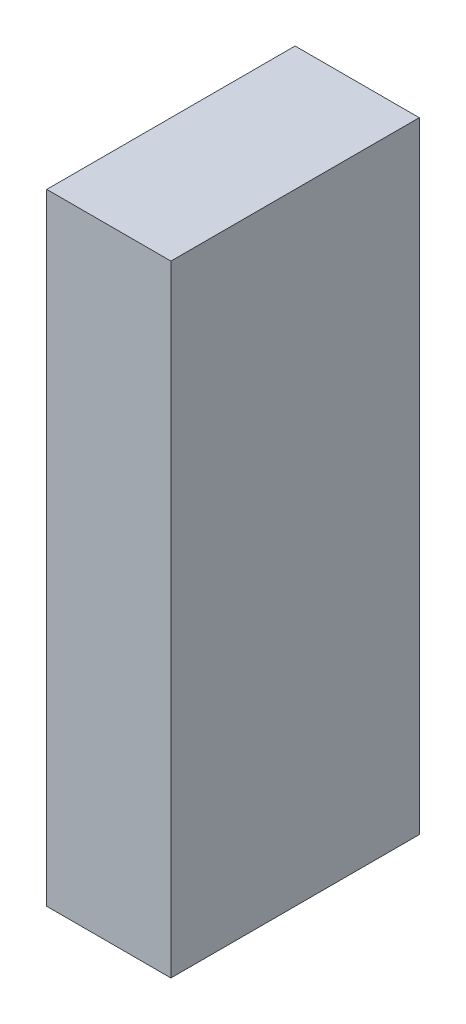
ISO-10303-21;
HEADER;
FILE_DESCRIPTION(('STEP AP214'),'2;1');
FILE_NAME('part.step','',(''),(''),'','','');
FILE_SCHEMA(('AUTOMOTIVE_DESIGN { 1 0 10303 214 1 1 1 1 }'));
ENDSEC;
DATA;
#1=APPLICATION_CONTEXT('core data for automotive mechanical design processes');
#2=APPLICATION_PROTOCOL_DEFINITION('international standard','automotive_design',2000,#1);
#3=PRODUCT_CONTEXT('',#1,'mechanical');
#4=PRODUCT('Part','Part','',(#3));
#5=PRODUCT_RELATED_PRODUCT_CATEGORY('part','',(#4));
#6=PRODUCT_DEFINITION_FORMATION('','',#4);
#7=PRODUCT_DEFINITION_CONTEXT('part definition',#1,'design');
#8=PRODUCT_DEFINITION('design','',#6,#7);
#9=PRODUCT_DEFINITION_SHAPE('','',#8);
#10=(LENGTH_UNIT() NAMED_UNIT(*) SI_UNIT(.MILLI.,.METRE.));
#11=(NAMED_UNIT(*) PLANE_ANGLE_UNIT() SI_UNIT($,.RADIAN.));
#12=(NAMED_UNIT(*) SI_UNIT($,.STERADIAN.) SOLID_ANGLE_UNIT());
#13=UNCERTAINTY_MEASURE_WITH_UNIT(LENGTH_MEASURE(1.E-05),#10,'distance_accuracy_value','');
#14=(GEOMETRIC_REPRESENTATION_CONTEXT(3) GLOBAL_UNCERTAINTY_ASSIGNED_CONTEXT((#13)) GLOBAL_UNIT_ASSIGNED_CONTEXT((#10,
#11,#12)) REPRESENTATION_CONTEXT('',''));
#15=CARTESIAN_POINT('',(0.,0.,0.));
#16=DIRECTION('',(0.,0.,1.));
#17=DIRECTION('',(1.,0.,0.));
#18=AXIS2_PLACEMENT_3D('',#15,#16,#17);
#19=CARTESIAN_POINT('',(-25.,250.,50.));
#20=DIRECTION('',(1.,0.,0.));
#21=DIRECTION('',(0.,0.,-1.));
#22=AXIS2_PLACEMENT_3D('',#19,#20,#21);
#23=PLANE('',#22);
#24=CARTESIAN_POINT('',(-25.,100.,38.));
#25=DIRECTION('',(-1.,0.,0.));
#26=DIRECTION('',(0.,0.,1.));
#27=AXIS2_PLACEMENT_3D('',#24,#25,#26);
#28=CIRCLE('',#27,1.5);
#29=CARTESIAN_POINT('',(-25.,100.,39.5));
#30=VERTEX_POINT('',#29);
#31=EDGE_CURVE('E128',#30,#30,#28,.T.);
#32=ORIENTED_EDGE('',*,*,#31,.F.);
#33=EDGE_LOOP('',(#32));
#34=FACE_BOUND('',#33,.T.);
#35=CARTESIAN_POINT('',(-25.,225.,-38.));
#36=DIRECTION('',(-1.,0.,0.));
#37=DIRECTION('',(0.,0.,1.));
#38=AXIS2_PLACEMENT_3D('',#35,#36,#37);
#39=CIRCLE('',#38,1.5);
#40=CARTESIAN_POINT('',(-25.,225.,-36.5));
#41=VERTEX_POINT('',#40);
#42=EDGE_CURVE('E121',#41,#41,#39,.T.);
#43=ORIENTED_EDGE('',*,*,#42,.F.);
#44=EDGE_LOOP('',(#43));
#45=FACE_BOUND('',#44,.T.);
#46=CARTESIAN_POINT('',(-25.,100.,-38.));
#47=DIRECTION('',(-1.,0.,0.));
#48=DIRECTION('',(0.,0.,1.));
#49=AXIS2_PLACEMENT_3D('',#46,#47,#48);
#50=CIRCLE('',#49,1.5);
#51=CARTESIAN_POINT('',(-25.,100.,-36.5));
#52=VERTEX_POINT('',#51);
#53=EDGE_CURVE('E133',#52,#52,#50,.T.);
#54=ORIENTED_EDGE('',*,*,#53,.F.);
#55=EDGE_LOOP('',(#54));
#56=FACE_BOUND('',#55,.T.);
#57=CARTESIAN_POINT('',(-25.,225.,38.));
#58=DIRECTION('',(-1.,0.,0.));
#59=DIRECTION('',(0.,0.,1.));
#60=AXIS2_PLACEMENT_3D('',#57,#58,#59);
#61=CIRCLE('',#60,1.5);
#62=CARTESIAN_POINT('',(-25.,225.,39.5));
#63=VERTEX_POINT('',#62);
#64=EDGE_CURVE('E115',#63,#63,#61,.T.);
#65=ORIENTED_EDGE('',*,*,#64,.F.);
#66=EDGE_LOOP('',(#65));
#67=FACE_BOUND('',#66,.T.);
#68=DIRECTION('',(0.,0.,1.));
#69=VECTOR('',#68,1.);
#70=CARTESIAN_POINT('',(-25.,0.,50.));
#71=LINE('',#70,#69);
#72=CARTESIAN_POINT('',(-25.,0.,-50.));
#73=VERTEX_POINT('',#72);
#74=CARTESIAN_POINT('',(-25.,0.,50.));
#75=VERTEX_POINT('',#74);
#76=EDGE_CURVE('E101',#73,#75,#71,.T.);
#77=ORIENTED_EDGE('',*,*,#76,.T.);
#78=DIRECTION('',(0.,-1.,0.));
#79=VECTOR('',#78,1.);
#80=CARTESIAN_POINT('',(-25.,250.,50.));
#81=LINE('',#80,#79);
#82=CARTESIAN_POINT('',(-25.,250.,50.));
#83=VERTEX_POINT('',#82);
#84=EDGE_CURVE('E11',#83,#75,#81,.T.);
#85=ORIENTED_EDGE('',*,*,#84,.F.);
#86=DIRECTION('',(0.,0.,1.));
#87=VECTOR('',#86,1.);
#88=CARTESIAN_POINT('',(-25.,250.,50.));
#89=LINE('',#88,#87);
#90=CARTESIAN_POINT('',(-25.,250.,-50.));
#91=VERTEX_POINT('',#90);
#92=EDGE_CURVE('E89',#91,#83,#89,.T.);
#93=ORIENTED_EDGE('',*,*,#92,.F.);
#94=DIRECTION('',(0.,-1.,0.));
#95=VECTOR('',#94,1.);
#96=CARTESIAN_POINT('',(-25.,250.,-50.));
#97=LINE('',#96,#95);
#98=EDGE_CURVE('E97',#91,#73,#97,.T.);
#99=ORIENTED_EDGE('',*,*,#98,.T.);
#100=EDGE_LOOP('',(#77,#85,#93,#99));
#101=FACE_BOUND('',#100,.T.);
#102=ADVANCED_FACE('F38',(#34,#45,#56,#67,#101),#23,.F.);
#103=CARTESIAN_POINT('',(25.,250.,50.));
#104=DIRECTION('',(0.,0.,-1.));
#105=DIRECTION('',(-1.,0.,0.));
#106=AXIS2_PLACEMENT_3D('',#103,#104,#105);
#107=PLANE('',#106);
#108=DIRECTION('',(1.,0.,0.));
#109=VECTOR('',#108,1.);
#110=CARTESIAN_POINT('',(25.,0.,50.));
#111=LINE('',#110,#109);
#112=CARTESIAN_POINT('',(25.,0.,50.));
#113=VERTEX_POINT('',#112);
#114=EDGE_CURVE('E93',#75,#113,#111,.T.);
#115=ORIENTED_EDGE('',*,*,#114,.T.);
#116=DIRECTION('',(0.,-1.,0.));
#117=VECTOR('',#116,1.);
#118=CARTESIAN_POINT('',(25.,250.,50.));
#119=LINE('',#118,#117);
#120=CARTESIAN_POINT('',(25.,250.,50.));
#121=VERTEX_POINT('',#120);
#122=EDGE_CURVE('E46',#121,#113,#119,.T.);
#123=ORIENTED_EDGE('',*,*,#122,.F.);
#124=DIRECTION('',(1.,0.,0.));
#125=VECTOR('',#124,1.);
#126=CARTESIAN_POINT('',(25.,250.,50.));
#127=LINE('',#126,#125);
#128=EDGE_CURVE('E84',#83,#121,#127,.T.);
#129=ORIENTED_EDGE('',*,*,#128,.F.);
#130=ORIENTED_EDGE('',*,*,#84,.T.);
#131=EDGE_LOOP('',(#115,#123,#129,#130));
#132=FACE_BOUND('',#131,.T.);
#133=ADVANCED_FACE('F92',(#132),#107,.F.);
#134=CARTESIAN_POINT('',(25.,250.,50.));
#135=DIRECTION('',(-1.,0.,0.));
#136=DIRECTION('',(0.,0.,1.));
#137=AXIS2_PLACEMENT_3D('',#134,#135,#136);
#138=PLANE('',#137);
#139=DIRECTION('',(0.,0.,-1.));
#140=VECTOR('',#139,1.);
#141=CARTESIAN_POINT('',(25.,0.,50.));
#142=LINE('',#141,#140);
#143=CARTESIAN_POINT('',(25.,0.,-50.));
#144=VERTEX_POINT('',#143);
#145=EDGE_CURVE('E71',#113,#144,#142,.T.);
#146=ORIENTED_EDGE('',*,*,#145,.T.);
#147=DIRECTION('',(0.,-1.,0.));
#148=VECTOR('',#147,1.);
#149=CARTESIAN_POINT('',(25.,250.,-50.));
#150=LINE('',#149,#148);
#151=CARTESIAN_POINT('',(25.,250.,-50.));
#152=VERTEX_POINT('',#151);
#153=EDGE_CURVE('E94',#152,#144,#150,.T.);
#154=ORIENTED_EDGE('',*,*,#153,.F.);
#155=DIRECTION('',(0.,0.,-1.));
#156=VECTOR('',#155,1.);
#157=CARTESIAN_POINT('',(25.,250.,50.));
#158=LINE('',#157,#156);
#159=EDGE_CURVE('E87',#121,#152,#158,.T.);
#160=ORIENTED_EDGE('',*,*,#159,.F.);
#161=ORIENTED_EDGE('',*,*,#122,.T.);
#162=EDGE_LOOP('',(#146,#154,#160,#161));
#163=FACE_BOUND('',#162,.T.);
#164=ADVANCED_FACE('F95',(#163),#138,.F.);
#165=CARTESIAN_POINT('',(25.,250.,-50.));
#166=DIRECTION('',(0.,0.,1.));
#167=DIRECTION('',(1.,0.,0.));
#168=AXIS2_PLACEMENT_3D('',#165,#166,#167);
#169=PLANE('',#168);
#170=CARTESIAN_POINT('',(0.250000000000007,47.,-50.));
#171=DIRECTION('',(0.,0.,-1.));
#172=DIRECTION('',(-1.,0.,0.));
#173=AXIS2_PLACEMENT_3D('',#170,#171,#172);
#174=CIRCLE('',#173,1.5);
#175=CARTESIAN_POINT('',(-1.24999999999999,47.,-50.));
#176=VERTEX_POINT('',#175);
#177=EDGE_CURVE('E145',#176,#176,#174,.T.);
#178=ORIENTED_EDGE('',*,*,#177,.F.);
#179=EDGE_LOOP('',(#178));
#180=FACE_BOUND('',#179,.T.);
#181=CARTESIAN_POINT('',(11.25,47.,-50.));
#182=DIRECTION('',(0.,0.,-1.));
#183=DIRECTION('',(-1.,0.,0.));
#184=AXIS2_PLACEMENT_3D('',#181,#182,#183);
#185=CIRCLE('',#184,1.5);
#186=CARTESIAN_POINT('',(9.75000000000001,47.,-50.));
#187=VERTEX_POINT('',#186);
#188=EDGE_CURVE('E139',#187,#187,#185,.T.);
#189=ORIENTED_EDGE('',*,*,#188,.F.);
#190=EDGE_LOOP('',(#189));
#191=FACE_BOUND('',#190,.T.);
#192=DIRECTION('',(-1.,0.,0.));
#193=VECTOR('',#192,1.);
#194=CARTESIAN_POINT('',(25.,0.,-50.));
#195=LINE('',#194,#193);
#196=EDGE_CURVE('E77',#144,#73,#195,.T.);
#197=ORIENTED_EDGE('',*,*,#196,.T.);
#198=ORIENTED_EDGE('',*,*,#98,.F.);
#199=DIRECTION('',(-1.,0.,0.));
#200=VECTOR('',#199,1.);
#201=CARTESIAN_POINT('',(25.,250.,-50.));
#202=LINE('',#201,#200);
#203=EDGE_CURVE('E54',#152,#91,#202,.T.);
#204=ORIENTED_EDGE('',*,*,#203,.F.);
#205=ORIENTED_EDGE('',*,*,#153,.T.);
#206=EDGE_LOOP('',(#197,#198,#204,#205));
#207=FACE_BOUND('',#206,.T.);
#208=ADVANCED_FACE('F109',(#180,#191,#207),#169,.F.);
#209=CARTESIAN_POINT('',(0.,250.,0.));
#210=DIRECTION('',(0.,1.,0.));
#211=DIRECTION('',(0.,0.,1.));
#212=AXIS2_PLACEMENT_3D('',#209,#210,#211);
#213=PLANE('',#212);
#214=ORIENTED_EDGE('',*,*,#92,.T.);
#215=ORIENTED_EDGE('',*,*,#128,.T.);
#216=ORIENTED_EDGE('',*,*,#159,.T.);
#217=ORIENTED_EDGE('',*,*,#203,.T.);
#218=EDGE_LOOP('',(#214,#215,#216,#217));
#219=FACE_BOUND('',#218,.T.);
#220=ADVANCED_FACE('F85',(#219),#213,.T.);
#221=CARTESIAN_POINT('',(0.,0.,0.));
#222=DIRECTION('',(0.,1.,0.));
#223=DIRECTION('',(0.,0.,1.));
#224=AXIS2_PLACEMENT_3D('',#221,#222,#223);
#225=PLANE('',#224);
#226=ORIENTED_EDGE('',*,*,#76,.F.);
#227=ORIENTED_EDGE('',*,*,#196,.F.);
#228=ORIENTED_EDGE('',*,*,#145,.F.);
#229=ORIENTED_EDGE('',*,*,#114,.F.);
#230=EDGE_LOOP('',(#226,#227,#228,#229));
#231=FACE_BOUND('',#230,.T.);
#232=ADVANCED_FACE('F112',(#231),#225,.F.);
#233=CARTESIAN_POINT('',(-20.,225.,38.));
#234=DIRECTION('',(-1.,0.,0.));
#235=DIRECTION('',(0.,0.,1.));
#236=AXIS2_PLACEMENT_3D('',#233,#234,#235);
#237=CYLINDRICAL_SURFACE('',#236,1.5);
#238=CARTESIAN_POINT('',(-20.,225.,38.));
#239=DIRECTION('',(-1.,0.,0.));
#240=DIRECTION('',(0.,0.,1.));
#241=AXIS2_PLACEMENT_3D('',#238,#239,#240);
#242=CIRCLE('',#241,1.5);
#243=CARTESIAN_POINT('',(-20.,225.,39.5));
#244=VERTEX_POINT('',#243);
#245=EDGE_CURVE('E104',#244,#244,#242,.T.);
#246=ORIENTED_EDGE('',*,*,#245,.F.);
#247=EDGE_LOOP('',(#246));
#248=FACE_BOUND('',#247,.T.);
#249=ORIENTED_EDGE('',*,*,#64,.T.);
#250=EDGE_LOOP('',(#249));
#251=FACE_BOUND('',#250,.T.);
#252=ADVANCED_FACE('F194',(#248,#251),#237,.F.);
#253=CARTESIAN_POINT('',(-20.,225.,38.));
#254=DIRECTION('',(-1.,0.,0.));
#255=DIRECTION('',(0.,0.,1.));
#256=AXIS2_PLACEMENT_3D('',#253,#254,#255);
#257=PLANE('',#256);
#258=ORIENTED_EDGE('',*,*,#245,.T.);
#259=EDGE_LOOP('',(#258));
#260=FACE_BOUND('',#259,.T.);
#261=ADVANCED_FACE('F196',(#260),#257,.T.);
#262=CARTESIAN_POINT('',(-20.,100.,-38.));
#263=DIRECTION('',(-1.,0.,0.));
#264=DIRECTION('',(0.,0.,1.));
#265=AXIS2_PLACEMENT_3D('',#262,#263,#264);
#266=CYLINDRICAL_SURFACE('',#265,1.5);
#267=CARTESIAN_POINT('',(-20.,100.,-38.));
#268=DIRECTION('',(-1.,0.,0.));
#269=DIRECTION('',(0.,0.,1.));
#270=AXIS2_PLACEMENT_3D('',#267,#268,#269);
#271=CIRCLE('',#270,1.5);
#272=CARTESIAN_POINT('',(-20.,100.,-36.5));
#273=VERTEX_POINT('',#272);
#274=EDGE_CURVE('E125',#273,#273,#271,.T.);
#275=ORIENTED_EDGE('',*,*,#274,.F.);
#276=EDGE_LOOP('',(#275));
#277=FACE_BOUND('',#276,.T.);
#278=ORIENTED_EDGE('',*,*,#53,.T.);
#279=EDGE_LOOP('',(#278));
#280=FACE_BOUND('',#279,.T.);
#281=ADVANCED_FACE('F203',(#277,#280),#266,.F.);
#282=CARTESIAN_POINT('',(-20.,100.,-38.));
#283=DIRECTION('',(-1.,0.,0.));
#284=DIRECTION('',(0.,0.,1.));
#285=AXIS2_PLACEMENT_3D('',#282,#283,#284);
#286=PLANE('',#285);
#287=ORIENTED_EDGE('',*,*,#274,.T.);
#288=EDGE_LOOP('',(#287));
#289=FACE_BOUND('',#288,.T.);
#290=ADVANCED_FACE('F256',(#289),#286,.T.);
#291=CARTESIAN_POINT('',(-20.,225.,-38.));
#292=DIRECTION('',(-1.,0.,0.));
#293=DIRECTION('',(0.,0.,1.));
#294=AXIS2_PLACEMENT_3D('',#291,#292,#293);
#295=CYLINDRICAL_SURFACE('',#294,1.5);
#296=CARTESIAN_POINT('',(-20.,225.,-38.));
#297=DIRECTION('',(-1.,0.,0.));
#298=DIRECTION('',(0.,0.,1.));
#299=AXIS2_PLACEMENT_3D('',#296,#297,#298);
#300=CIRCLE('',#299,1.5);
#301=CARTESIAN_POINT('',(-20.,225.,-36.5));
#302=VERTEX_POINT('',#301);
#303=EDGE_CURVE('E124',#302,#302,#300,.T.);
#304=ORIENTED_EDGE('',*,*,#303,.F.);
#305=EDGE_LOOP('',(#304));
#306=FACE_BOUND('',#305,.T.);
#307=ORIENTED_EDGE('',*,*,#42,.T.);
#308=EDGE_LOOP('',(#307));
#309=FACE_BOUND('',#308,.T.);
#310=ADVANCED_FACE('F266',(#306,#309),#295,.F.);
#311=CARTESIAN_POINT('',(-20.,225.,-38.));
#312=DIRECTION('',(-1.,0.,0.));
#313=DIRECTION('',(0.,0.,1.));
#314=AXIS2_PLACEMENT_3D('',#311,#312,#313);
#315=PLANE('',#314);
#316=ORIENTED_EDGE('',*,*,#303,.T.);
#317=EDGE_LOOP('',(#316));
#318=FACE_BOUND('',#317,.T.);
#319=ADVANCED_FACE('F275',(#318),#315,.T.);
#320=CARTESIAN_POINT('',(-20.,100.,38.));
#321=DIRECTION('',(-1.,0.,0.));
#322=DIRECTION('',(0.,0.,1.));
#323=AXIS2_PLACEMENT_3D('',#320,#321,#322);
#324=CYLINDRICAL_SURFACE('',#323,1.5);
#325=CARTESIAN_POINT('',(-20.,100.,38.));
#326=DIRECTION('',(-1.,0.,0.));
#327=DIRECTION('',(0.,0.,1.));
#328=AXIS2_PLACEMENT_3D('',#325,#326,#327);
#329=CIRCLE('',#328,1.5);
#330=CARTESIAN_POINT('',(-20.,100.,39.5));
#331=VERTEX_POINT('',#330);
#332=EDGE_CURVE('E118',#331,#331,#329,.T.);
#333=ORIENTED_EDGE('',*,*,#332,.F.);
#334=EDGE_LOOP('',(#333));
#335=FACE_BOUND('',#334,.T.);
#336=ORIENTED_EDGE('',*,*,#31,.T.);
#337=EDGE_LOOP('',(#336));
#338=FACE_BOUND('',#337,.T.);
#339=ADVANCED_FACE('F176',(#335,#338),#324,.F.);
#340=CARTESIAN_POINT('',(-20.,100.,38.));
#341=DIRECTION('',(-1.,0.,0.));
#342=DIRECTION('',(0.,0.,1.));
#343=AXIS2_PLACEMENT_3D('',#340,#341,#342);
#344=PLANE('',#343);
#345=ORIENTED_EDGE('',*,*,#332,.T.);
#346=EDGE_LOOP('',(#345));
#347=FACE_BOUND('',#346,.T.);
#348=ADVANCED_FACE('F167',(#347),#344,.T.);
#349=CARTESIAN_POINT('',(11.25,47.,-45.));
#350=DIRECTION('',(0.,0.,-1.));
#351=DIRECTION('',(-1.,0.,0.));
#352=AXIS2_PLACEMENT_3D('',#349,#350,#351);
#353=CYLINDRICAL_SURFACE('',#352,1.5);
#354=CARTESIAN_POINT('',(11.25,47.,-45.));
#355=DIRECTION('',(0.,0.,-1.));
#356=DIRECTION('',(-1.,0.,0.));
#357=AXIS2_PLACEMENT_3D('',#354,#355,#356);
#358=CIRCLE('',#357,1.5);
#359=CARTESIAN_POINT('',(9.75000000000001,47.,-45.));
#360=VERTEX_POINT('',#359);
#361=EDGE_CURVE('E142',#360,#360,#358,.T.);
#362=ORIENTED_EDGE('',*,*,#361,.F.);
#363=EDGE_LOOP('',(#362));
#364=FACE_BOUND('',#363,.T.);
#365=ORIENTED_EDGE('',*,*,#188,.T.);
#366=EDGE_LOOP('',(#365));
#367=FACE_BOUND('',#366,.T.);
#368=ADVANCED_FACE('F165',(#364,#367),#353,.F.);
#369=CARTESIAN_POINT('',(11.25,47.,-45.));
#370=DIRECTION('',(0.,0.,-1.));
#371=DIRECTION('',(-1.,0.,0.));
#372=AXIS2_PLACEMENT_3D('',#369,#370,#371);
#373=PLANE('',#372);
#374=ORIENTED_EDGE('',*,*,#361,.T.);
#375=EDGE_LOOP('',(#374));
#376=FACE_BOUND('',#375,.T.);
#377=ADVANCED_FACE('F156',(#376),#373,.T.);
#378=CARTESIAN_POINT('',(0.250000000000007,47.,-45.));
#379=DIRECTION('',(0.,0.,-1.));
#380=DIRECTION('',(-1.,0.,0.));
#381=AXIS2_PLACEMENT_3D('',#378,#379,#380);
#382=CYLINDRICAL_SURFACE('',#381,1.5);
#383=CARTESIAN_POINT('',(0.250000000000007,47.,-45.));
#384=DIRECTION('',(0.,0.,-1.));
#385=DIRECTION('',(-1.,0.,0.));
#386=AXIS2_PLACEMENT_3D('',#383,#384,#385);
#387=CIRCLE('',#386,1.5);
#388=CARTESIAN_POINT('',(-1.24999999999999,47.,-45.));
#389=VERTEX_POINT('',#388);
#390=EDGE_CURVE('E136',#389,#389,#387,.T.);
#391=ORIENTED_EDGE('',*,*,#390,.F.);
#392=EDGE_LOOP('',(#391));
#393=FACE_BOUND('',#392,.T.);
#394=ORIENTED_EDGE('',*,*,#177,.T.);
#395=EDGE_LOOP('',(#394));
#396=FACE_BOUND('',#395,.T.);
#397=ADVANCED_FACE('F153',(#393,#396),#382,.F.);
#398=CARTESIAN_POINT('',(0.250000000000007,47.,-45.));
#399=DIRECTION('',(0.,0.,-1.));
#400=DIRECTION('',(-1.,0.,0.));
#401=AXIS2_PLACEMENT_3D('',#398,#399,#400);
#402=PLANE('',#401);
#403=ORIENTED_EDGE('',*,*,#390,.T.);
#404=EDGE_LOOP('',(#403));
#405=FACE_BOUND('',#404,.T.);
#406=ADVANCED_FACE('F151',(#405),#402,.T.);
#407=CLOSED_SHELL('',(#102,#133,#164,#208,#220,#232,#252,#261,#281,#290,#310,#319,#339,#348,
#368,#377,#397,#406));
#408=MANIFOLD_SOLID_BREP('B2',#407);
#409=ADVANCED_BREP_SHAPE_REPRESENTATION('',(#18,#408),#14);
#410=SHAPE_DEFINITION_REPRESENTATION(#9,#409);
ENDSEC;
END-ISO-10303-21;
